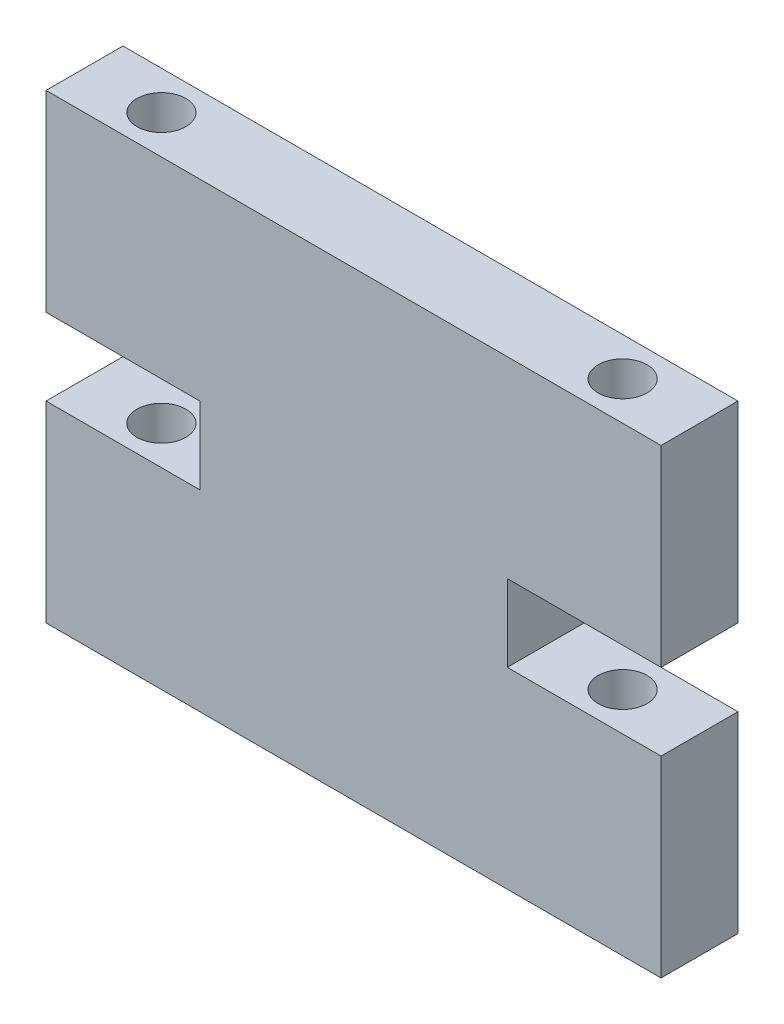
ISO-10303-21;
HEADER;
FILE_DESCRIPTION(('STEP AP214'),'2;1');
FILE_NAME('part.step','',(''),(''),'','','');
FILE_SCHEMA(('AUTOMOTIVE_DESIGN { 1 0 10303 214 1 1 1 1 }'));
ENDSEC;
DATA;
#1=APPLICATION_CONTEXT('core data for automotive mechanical design processes');
#2=APPLICATION_PROTOCOL_DEFINITION('international standard','automotive_design',2000,#1);
#3=PRODUCT_CONTEXT('',#1,'mechanical');
#4=PRODUCT('Part','Part','',(#3));
#5=PRODUCT_RELATED_PRODUCT_CATEGORY('part','',(#4));
#6=PRODUCT_DEFINITION_FORMATION('','',#4);
#7=PRODUCT_DEFINITION_CONTEXT('part definition',#1,'design');
#8=PRODUCT_DEFINITION('design','',#6,#7);
#9=PRODUCT_DEFINITION_SHAPE('','',#8);
#10=(LENGTH_UNIT() NAMED_UNIT(*) SI_UNIT(.MILLI.,.METRE.));
#11=(NAMED_UNIT(*) PLANE_ANGLE_UNIT() SI_UNIT($,.RADIAN.));
#12=(NAMED_UNIT(*) SI_UNIT($,.STERADIAN.) SOLID_ANGLE_UNIT());
#13=UNCERTAINTY_MEASURE_WITH_UNIT(LENGTH_MEASURE(1.E-05),#10,'distance_accuracy_value','');
#14=(GEOMETRIC_REPRESENTATION_CONTEXT(3) GLOBAL_UNCERTAINTY_ASSIGNED_CONTEXT((#13)) GLOBAL_UNIT_ASSIGNED_CONTEXT((#10,
#11,#12)) REPRESENTATION_CONTEXT('',''));
#15=CARTESIAN_POINT('',(0.,0.,0.));
#16=DIRECTION('',(0.,0.,1.));
#17=DIRECTION('',(1.,0.,0.));
#18=AXIS2_PLACEMENT_3D('',#15,#16,#17);
#19=CARTESIAN_POINT('',(20.,-15.,5.));
#20=DIRECTION('',(-1.,0.,0.));
#21=DIRECTION('',(0.,-1.,0.));
#22=AXIS2_PLACEMENT_3D('',#19,#20,#21);
#23=PLANE('',#22);
#24=DIRECTION('',(0.,1.,0.));
#25=VECTOR('',#24,1.);
#26=CARTESIAN_POINT('',(20.,-15.,0.));
#27=LINE('',#26,#25);
#28=CARTESIAN_POINT('',(20.,-15.,0.));
#29=VERTEX_POINT('',#28);
#30=CARTESIAN_POINT('',(20.,-2.5,0.));
#31=VERTEX_POINT('',#30);
#32=EDGE_CURVE('E158',#29,#31,#27,.T.);
#33=ORIENTED_EDGE('',*,*,#32,.T.);
#34=DIRECTION('',(0.,0.,-1.));
#35=VECTOR('',#34,1.);
#36=CARTESIAN_POINT('',(20.,-2.5,5.));
#37=LINE('',#36,#35);
#38=CARTESIAN_POINT('',(20.,-2.5,5.));
#39=VERTEX_POINT('',#38);
#40=EDGE_CURVE('E41',#39,#31,#37,.T.);
#41=ORIENTED_EDGE('',*,*,#40,.F.);
#42=DIRECTION('',(0.,1.,0.));
#43=VECTOR('',#42,1.);
#44=CARTESIAN_POINT('',(20.,-15.,5.));
#45=LINE('',#44,#43);
#46=CARTESIAN_POINT('',(20.,-15.,5.));
#47=VERTEX_POINT('',#46);
#48=EDGE_CURVE('E106',#47,#39,#45,.T.);
#49=ORIENTED_EDGE('',*,*,#48,.F.);
#50=DIRECTION('',(0.,0.,-1.));
#51=VECTOR('',#50,1.);
#52=CARTESIAN_POINT('',(20.,-15.,5.));
#53=LINE('',#52,#51);
#54=EDGE_CURVE('E11',#47,#29,#53,.T.);
#55=ORIENTED_EDGE('',*,*,#54,.T.);
#56=EDGE_LOOP('',(#33,#41,#49,#55));
#57=FACE_BOUND('',#56,.T.);
#58=ADVANCED_FACE('F33',(#57),#23,.F.);
#59=CARTESIAN_POINT('',(10.,-2.5,5.));
#60=DIRECTION('',(0.,-1.,0.));
#61=DIRECTION('',(1.,0.,0.));
#62=AXIS2_PLACEMENT_3D('',#59,#60,#61);
#63=PLANE('',#62);
#64=CARTESIAN_POINT('',(15.,-2.5,2.5));
#65=DIRECTION('',(0.,-1.,0.));
#66=DIRECTION('',(1.,0.,0.));
#67=AXIS2_PLACEMENT_3D('',#64,#65,#66);
#68=CIRCLE('',#67,1.59181252452168);
#69=CARTESIAN_POINT('',(16.5918125245217,-2.5,2.5));
#70=VERTEX_POINT('',#69);
#71=EDGE_CURVE('E305',#70,#70,#68,.F.);
#72=ORIENTED_EDGE('',*,*,#71,.F.);
#73=EDGE_LOOP('',(#72));
#74=FACE_BOUND('',#73,.T.);
#75=DIRECTION('',(-1.,0.,0.));
#76=VECTOR('',#75,1.);
#77=CARTESIAN_POINT('',(10.,-2.5,0.));
#78=LINE('',#77,#76);
#79=CARTESIAN_POINT('',(10.,-2.5,0.));
#80=VERTEX_POINT('',#79);
#81=EDGE_CURVE('E160',#31,#80,#78,.T.);
#82=ORIENTED_EDGE('',*,*,#81,.T.);
#83=DIRECTION('',(0.,0.,-1.));
#84=VECTOR('',#83,1.);
#85=CARTESIAN_POINT('',(10.,-2.5,5.));
#86=LINE('',#85,#84);
#87=CARTESIAN_POINT('',(10.,-2.5,5.));
#88=VERTEX_POINT('',#87);
#89=EDGE_CURVE('E199',#88,#80,#86,.T.);
#90=ORIENTED_EDGE('',*,*,#89,.F.);
#91=DIRECTION('',(-1.,0.,0.));
#92=VECTOR('',#91,1.);
#93=CARTESIAN_POINT('',(10.,-2.5,5.));
#94=LINE('',#93,#92);
#95=EDGE_CURVE('E207',#39,#88,#94,.T.);
#96=ORIENTED_EDGE('',*,*,#95,.F.);
#97=ORIENTED_EDGE('',*,*,#40,.T.);
#98=EDGE_LOOP('',(#82,#90,#96,#97));
#99=FACE_BOUND('',#98,.T.);
#100=ADVANCED_FACE('F205',(#74,#99),#63,.F.);
#101=CARTESIAN_POINT('',(10.,2.5,5.));
#102=DIRECTION('',(-1.,0.,0.));
#103=DIRECTION('',(0.,0.,1.));
#104=AXIS2_PLACEMENT_3D('',#101,#102,#103);
#105=PLANE('',#104);
#106=DIRECTION('',(0.,1.,0.));
#107=VECTOR('',#106,1.);
#108=CARTESIAN_POINT('',(10.,2.5,0.));
#109=LINE('',#108,#107);
#110=CARTESIAN_POINT('',(10.,2.5,0.));
#111=VERTEX_POINT('',#110);
#112=EDGE_CURVE('E163',#80,#111,#109,.T.);
#113=ORIENTED_EDGE('',*,*,#112,.T.);
#114=DIRECTION('',(0.,0.,-1.));
#115=VECTOR('',#114,1.);
#116=CARTESIAN_POINT('',(10.,2.5,5.));
#117=LINE('',#116,#115);
#118=CARTESIAN_POINT('',(10.,2.5,5.));
#119=VERTEX_POINT('',#118);
#120=EDGE_CURVE('E196',#119,#111,#117,.T.);
#121=ORIENTED_EDGE('',*,*,#120,.F.);
#122=DIRECTION('',(0.,1.,0.));
#123=VECTOR('',#122,1.);
#124=CARTESIAN_POINT('',(10.,2.5,5.));
#125=LINE('',#124,#123);
#126=EDGE_CURVE('E223',#88,#119,#125,.T.);
#127=ORIENTED_EDGE('',*,*,#126,.F.);
#128=ORIENTED_EDGE('',*,*,#89,.T.);
#129=EDGE_LOOP('',(#113,#121,#127,#128));
#130=FACE_BOUND('',#129,.T.);
#131=ADVANCED_FACE('F214',(#130),#105,.F.);
#132=CARTESIAN_POINT('',(10.,2.5,5.));
#133=DIRECTION('',(0.,1.,0.));
#134=DIRECTION('',(-1.,0.,0.));
#135=AXIS2_PLACEMENT_3D('',#132,#133,#134);
#136=PLANE('',#135);
#137=CARTESIAN_POINT('',(15.,2.5,2.5));
#138=DIRECTION('',(0.,1.,0.));
#139=DIRECTION('',(-1.,0.,0.));
#140=AXIS2_PLACEMENT_3D('',#137,#138,#139);
#141=CIRCLE('',#140,1.59181252452168);
#142=CARTESIAN_POINT('',(13.4081874754783,2.5,2.5));
#143=VERTEX_POINT('',#142);
#144=EDGE_CURVE('E307',#143,#143,#141,.F.);
#145=ORIENTED_EDGE('',*,*,#144,.F.);
#146=EDGE_LOOP('',(#145));
#147=FACE_BOUND('',#146,.T.);
#148=DIRECTION('',(1.,0.,0.));
#149=VECTOR('',#148,1.);
#150=CARTESIAN_POINT('',(10.,2.5,0.));
#151=LINE('',#150,#149);
#152=CARTESIAN_POINT('',(20.,2.5,0.));
#153=VERTEX_POINT('',#152);
#154=EDGE_CURVE('E165',#111,#153,#151,.T.);
#155=ORIENTED_EDGE('',*,*,#154,.T.);
#156=DIRECTION('',(0.,0.,-1.));
#157=VECTOR('',#156,1.);
#158=CARTESIAN_POINT('',(20.,2.5,5.));
#159=LINE('',#158,#157);
#160=CARTESIAN_POINT('',(20.,2.5,5.));
#161=VERTEX_POINT('',#160);
#162=EDGE_CURVE('E193',#161,#153,#159,.T.);
#163=ORIENTED_EDGE('',*,*,#162,.F.);
#164=DIRECTION('',(1.,0.,0.));
#165=VECTOR('',#164,1.);
#166=CARTESIAN_POINT('',(10.,2.5,5.));
#167=LINE('',#166,#165);
#168=EDGE_CURVE('E220',#119,#161,#167,.T.);
#169=ORIENTED_EDGE('',*,*,#168,.F.);
#170=ORIENTED_EDGE('',*,*,#120,.T.);
#171=EDGE_LOOP('',(#155,#163,#169,#170));
#172=FACE_BOUND('',#171,.T.);
#173=ADVANCED_FACE('F218',(#147,#172),#136,.F.);
#174=CARTESIAN_POINT('',(20.,15.,5.));
#175=DIRECTION('',(-1.,0.,0.));
#176=DIRECTION('',(0.,-1.,0.));
#177=AXIS2_PLACEMENT_3D('',#174,#175,#176);
#178=PLANE('',#177);
#179=DIRECTION('',(0.,1.,0.));
#180=VECTOR('',#179,1.);
#181=CARTESIAN_POINT('',(20.,15.,0.));
#182=LINE('',#181,#180);
#183=CARTESIAN_POINT('',(20.,15.,0.));
#184=VERTEX_POINT('',#183);
#185=EDGE_CURVE('E167',#153,#184,#182,.T.);
#186=ORIENTED_EDGE('',*,*,#185,.T.);
#187=DIRECTION('',(0.,0.,-1.));
#188=VECTOR('',#187,1.);
#189=CARTESIAN_POINT('',(20.,15.,5.));
#190=LINE('',#189,#188);
#191=CARTESIAN_POINT('',(20.,15.,5.));
#192=VERTEX_POINT('',#191);
#193=EDGE_CURVE('E190',#192,#184,#190,.T.);
#194=ORIENTED_EDGE('',*,*,#193,.F.);
#195=DIRECTION('',(0.,1.,0.));
#196=VECTOR('',#195,1.);
#197=CARTESIAN_POINT('',(20.,15.,5.));
#198=LINE('',#197,#196);
#199=EDGE_CURVE('E222',#161,#192,#198,.T.);
#200=ORIENTED_EDGE('',*,*,#199,.F.);
#201=ORIENTED_EDGE('',*,*,#162,.T.);
#202=EDGE_LOOP('',(#186,#194,#200,#201));
#203=FACE_BOUND('',#202,.T.);
#204=ADVANCED_FACE('F259',(#203),#178,.F.);
#205=CARTESIAN_POINT('',(-15.,15.,5.));
#206=DIRECTION('',(0.,-1.,0.));
#207=DIRECTION('',(1.,0.,0.));
#208=AXIS2_PLACEMENT_3D('',#205,#206,#207);
#209=PLANE('',#208);
#210=CARTESIAN_POINT('',(15.,15.,2.5));
#211=DIRECTION('',(0.,-1.,0.));
#212=DIRECTION('',(1.,0.,0.));
#213=AXIS2_PLACEMENT_3D('',#210,#211,#212);
#214=CIRCLE('',#213,1.59181252452168);
#215=CARTESIAN_POINT('',(16.5918125245217,15.,2.5));
#216=VERTEX_POINT('',#215);
#217=EDGE_CURVE('E446',#216,#216,#214,.T.);
#218=ORIENTED_EDGE('',*,*,#217,.T.);
#219=EDGE_LOOP('',(#218));
#220=FACE_BOUND('',#219,.T.);
#221=CARTESIAN_POINT('',(-15.,15.,2.5));
#222=DIRECTION('',(0.,1.,0.));
#223=DIRECTION('',(-1.,0.,0.));
#224=AXIS2_PLACEMENT_3D('',#221,#222,#223);
#225=CIRCLE('',#224,1.59181252452168);
#226=CARTESIAN_POINT('',(-16.5918125245217,15.,2.5));
#227=VERTEX_POINT('',#226);
#228=EDGE_CURVE('E306',#227,#227,#225,.T.);
#229=ORIENTED_EDGE('',*,*,#228,.F.);
#230=EDGE_LOOP('',(#229));
#231=FACE_BOUND('',#230,.T.);
#232=DIRECTION('',(-1.,0.,0.));
#233=VECTOR('',#232,1.);
#234=CARTESIAN_POINT('',(-15.,15.,0.));
#235=LINE('',#234,#233);
#236=CARTESIAN_POINT('',(-20.,15.,0.));
#237=VERTEX_POINT('',#236);
#238=EDGE_CURVE('E170',#184,#237,#235,.T.);
#239=ORIENTED_EDGE('',*,*,#238,.T.);
#240=DIRECTION('',(0.,0.,-1.));
#241=VECTOR('',#240,1.);
#242=CARTESIAN_POINT('',(-20.,15.,5.));
#243=LINE('',#242,#241);
#244=CARTESIAN_POINT('',(-20.,15.,5.));
#245=VERTEX_POINT('',#244);
#246=EDGE_CURVE('E187',#245,#237,#243,.T.);
#247=ORIENTED_EDGE('',*,*,#246,.F.);
#248=DIRECTION('',(-1.,0.,0.));
#249=VECTOR('',#248,1.);
#250=CARTESIAN_POINT('',(15.,15.,5.));
#251=LINE('',#250,#249);
#252=EDGE_CURVE('E225',#192,#245,#251,.T.);
#253=ORIENTED_EDGE('',*,*,#252,.F.);
#254=ORIENTED_EDGE('',*,*,#193,.T.);
#255=EDGE_LOOP('',(#239,#247,#253,#254));
#256=FACE_BOUND('',#255,.T.);
#257=ADVANCED_FACE('F263',(#220,#231,#256),#209,.F.);
#258=CARTESIAN_POINT('',(-20.,15.,5.));
#259=DIRECTION('',(1.,0.,0.));
#260=DIRECTION('',(0.,1.,0.));
#261=AXIS2_PLACEMENT_3D('',#258,#259,#260);
#262=PLANE('',#261);
#263=DIRECTION('',(0.,-1.,0.));
#264=VECTOR('',#263,1.);
#265=CARTESIAN_POINT('',(-20.,15.,0.));
#266=LINE('',#265,#264);
#267=CARTESIAN_POINT('',(-20.,2.5,0.));
#268=VERTEX_POINT('',#267);
#269=EDGE_CURVE('E172',#237,#268,#266,.T.);
#270=ORIENTED_EDGE('',*,*,#269,.T.);
#271=DIRECTION('',(0.,0.,-1.));
#272=VECTOR('',#271,1.);
#273=CARTESIAN_POINT('',(-20.,2.5,5.));
#274=LINE('',#273,#272);
#275=CARTESIAN_POINT('',(-20.,2.5,5.));
#276=VERTEX_POINT('',#275);
#277=EDGE_CURVE('E184',#276,#268,#274,.T.);
#278=ORIENTED_EDGE('',*,*,#277,.F.);
#279=DIRECTION('',(0.,-1.,0.));
#280=VECTOR('',#279,1.);
#281=CARTESIAN_POINT('',(-20.,15.,5.));
#282=LINE('',#281,#280);
#283=EDGE_CURVE('E231',#245,#276,#282,.T.);
#284=ORIENTED_EDGE('',*,*,#283,.F.);
#285=ORIENTED_EDGE('',*,*,#246,.T.);
#286=EDGE_LOOP('',(#270,#278,#284,#285));
#287=FACE_BOUND('',#286,.T.);
#288=ADVANCED_FACE('F237',(#287),#262,.F.);
#289=CARTESIAN_POINT('',(-10.,2.5,5.));
#290=DIRECTION('',(0.,1.,0.));
#291=DIRECTION('',(-1.,0.,0.));
#292=AXIS2_PLACEMENT_3D('',#289,#290,#291);
#293=PLANE('',#292);
#294=CARTESIAN_POINT('',(-15.,2.5,2.5));
#295=DIRECTION('',(0.,1.,0.));
#296=DIRECTION('',(-1.,0.,0.));
#297=AXIS2_PLACEMENT_3D('',#294,#295,#296);
#298=CIRCLE('',#297,1.59181252452168);
#299=CARTESIAN_POINT('',(-16.5918125245217,2.5,2.5));
#300=VERTEX_POINT('',#299);
#301=EDGE_CURVE('E161',#300,#300,#298,.T.);
#302=ORIENTED_EDGE('',*,*,#301,.T.);
#303=EDGE_LOOP('',(#302));
#304=FACE_BOUND('',#303,.T.);
#305=DIRECTION('',(1.,0.,0.));
#306=VECTOR('',#305,1.);
#307=CARTESIAN_POINT('',(-10.,2.5,0.));
#308=LINE('',#307,#306);
#309=CARTESIAN_POINT('',(-10.,2.5,0.));
#310=VERTEX_POINT('',#309);
#311=EDGE_CURVE('E174',#268,#310,#308,.T.);
#312=ORIENTED_EDGE('',*,*,#311,.T.);
#313=DIRECTION('',(0.,0.,-1.));
#314=VECTOR('',#313,1.);
#315=CARTESIAN_POINT('',(-10.,2.5,5.));
#316=LINE('',#315,#314);
#317=CARTESIAN_POINT('',(-10.,2.5,5.));
#318=VERTEX_POINT('',#317);
#319=EDGE_CURVE('E147',#318,#310,#316,.T.);
#320=ORIENTED_EDGE('',*,*,#319,.F.);
#321=DIRECTION('',(1.,0.,0.));
#322=VECTOR('',#321,1.);
#323=CARTESIAN_POINT('',(-10.,2.5,5.));
#324=LINE('',#323,#322);
#325=EDGE_CURVE('E138',#276,#318,#324,.T.);
#326=ORIENTED_EDGE('',*,*,#325,.F.);
#327=ORIENTED_EDGE('',*,*,#277,.T.);
#328=EDGE_LOOP('',(#312,#320,#326,#327));
#329=FACE_BOUND('',#328,.T.);
#330=ADVANCED_FACE('F241',(#304,#329),#293,.F.);
#331=CARTESIAN_POINT('',(-10.,2.5,5.));
#332=DIRECTION('',(1.,0.,0.));
#333=DIRECTION('',(0.,0.,-1.));
#334=AXIS2_PLACEMENT_3D('',#331,#332,#333);
#335=PLANE('',#334);
#336=DIRECTION('',(0.,-1.,0.));
#337=VECTOR('',#336,1.);
#338=CARTESIAN_POINT('',(-10.,2.5,0.));
#339=LINE('',#338,#337);
#340=CARTESIAN_POINT('',(-10.,-2.5,0.));
#341=VERTEX_POINT('',#340);
#342=EDGE_CURVE('E146',#310,#341,#339,.T.);
#343=ORIENTED_EDGE('',*,*,#342,.T.);
#344=DIRECTION('',(0.,0.,-1.));
#345=VECTOR('',#344,1.);
#346=CARTESIAN_POINT('',(-10.,-2.5,5.));
#347=LINE('',#346,#345);
#348=CARTESIAN_POINT('',(-10.,-2.5,5.));
#349=VERTEX_POINT('',#348);
#350=EDGE_CURVE('E143',#349,#341,#347,.T.);
#351=ORIENTED_EDGE('',*,*,#350,.F.);
#352=DIRECTION('',(0.,-1.,0.));
#353=VECTOR('',#352,1.);
#354=CARTESIAN_POINT('',(-10.,2.5,5.));
#355=LINE('',#354,#353);
#356=EDGE_CURVE('E132',#318,#349,#355,.T.);
#357=ORIENTED_EDGE('',*,*,#356,.F.);
#358=ORIENTED_EDGE('',*,*,#319,.T.);
#359=EDGE_LOOP('',(#343,#351,#357,#358));
#360=FACE_BOUND('',#359,.T.);
#361=ADVANCED_FACE('F144',(#360),#335,.F.);
#362=CARTESIAN_POINT('',(-10.,-2.5,5.));
#363=DIRECTION('',(0.,-1.,0.));
#364=DIRECTION('',(1.,0.,0.));
#365=AXIS2_PLACEMENT_3D('',#362,#363,#364);
#366=PLANE('',#365);
#367=CARTESIAN_POINT('',(-15.,-2.5,2.5));
#368=DIRECTION('',(0.,-1.,0.));
#369=DIRECTION('',(1.,0.,0.));
#370=AXIS2_PLACEMENT_3D('',#367,#368,#369);
#371=CIRCLE('',#370,1.59181252452168);
#372=CARTESIAN_POINT('',(-13.4081874754783,-2.5,2.5));
#373=VERTEX_POINT('',#372);
#374=EDGE_CURVE('E317',#373,#373,#371,.T.);
#375=ORIENTED_EDGE('',*,*,#374,.T.);
#376=EDGE_LOOP('',(#375));
#377=FACE_BOUND('',#376,.T.);
#378=DIRECTION('',(-1.,0.,0.));
#379=VECTOR('',#378,1.);
#380=CARTESIAN_POINT('',(-10.,-2.5,0.));
#381=LINE('',#380,#379);
#382=CARTESIAN_POINT('',(-20.,-2.5,0.));
#383=VERTEX_POINT('',#382);
#384=EDGE_CURVE('E91',#341,#383,#381,.T.);
#385=ORIENTED_EDGE('',*,*,#384,.T.);
#386=DIRECTION('',(0.,0.,-1.));
#387=VECTOR('',#386,1.);
#388=CARTESIAN_POINT('',(-20.,-2.5,5.));
#389=LINE('',#388,#387);
#390=CARTESIAN_POINT('',(-20.,-2.5,5.));
#391=VERTEX_POINT('',#390);
#392=EDGE_CURVE('E148',#391,#383,#389,.T.);
#393=ORIENTED_EDGE('',*,*,#392,.F.);
#394=DIRECTION('',(-1.,0.,0.));
#395=VECTOR('',#394,1.);
#396=CARTESIAN_POINT('',(-10.,-2.5,5.));
#397=LINE('',#396,#395);
#398=EDGE_CURVE('E136',#349,#391,#397,.T.);
#399=ORIENTED_EDGE('',*,*,#398,.F.);
#400=ORIENTED_EDGE('',*,*,#350,.T.);
#401=EDGE_LOOP('',(#385,#393,#399,#400));
#402=FACE_BOUND('',#401,.T.);
#403=ADVANCED_FACE('F150',(#377,#402),#366,.F.);
#404=CARTESIAN_POINT('',(-20.,-15.,5.));
#405=DIRECTION('',(1.,0.,0.));
#406=DIRECTION('',(0.,1.,0.));
#407=AXIS2_PLACEMENT_3D('',#404,#405,#406);
#408=PLANE('',#407);
#409=DIRECTION('',(0.,-1.,0.));
#410=VECTOR('',#409,1.);
#411=CARTESIAN_POINT('',(-20.,-15.,0.));
#412=LINE('',#411,#410);
#413=CARTESIAN_POINT('',(-20.,-15.,0.));
#414=VERTEX_POINT('',#413);
#415=EDGE_CURVE('E178',#383,#414,#412,.T.);
#416=ORIENTED_EDGE('',*,*,#415,.T.);
#417=DIRECTION('',(0.,0.,-1.));
#418=VECTOR('',#417,1.);
#419=CARTESIAN_POINT('',(-20.,-15.,5.));
#420=LINE('',#419,#418);
#421=CARTESIAN_POINT('',(-20.,-15.,5.));
#422=VERTEX_POINT('',#421);
#423=EDGE_CURVE('E154',#422,#414,#420,.T.);
#424=ORIENTED_EDGE('',*,*,#423,.F.);
#425=DIRECTION('',(0.,-1.,0.));
#426=VECTOR('',#425,1.);
#427=CARTESIAN_POINT('',(-20.,-15.,5.));
#428=LINE('',#427,#426);
#429=EDGE_CURVE('E152',#391,#422,#428,.T.);
#430=ORIENTED_EDGE('',*,*,#429,.F.);
#431=ORIENTED_EDGE('',*,*,#392,.T.);
#432=EDGE_LOOP('',(#416,#424,#430,#431));
#433=FACE_BOUND('',#432,.T.);
#434=ADVANCED_FACE('F244',(#433),#408,.F.);
#435=CARTESIAN_POINT('',(-15.,-15.,5.));
#436=DIRECTION('',(0.,1.,0.));
#437=DIRECTION('',(0.,0.,1.));
#438=AXIS2_PLACEMENT_3D('',#435,#436,#437);
#439=PLANE('',#438);
#440=CARTESIAN_POINT('',(15.,-15.,2.5));
#441=DIRECTION('',(0.,-1.,0.));
#442=DIRECTION('',(1.,0.,0.));
#443=AXIS2_PLACEMENT_3D('',#440,#441,#442);
#444=CIRCLE('',#443,1.59181252452168);
#445=CARTESIAN_POINT('',(16.5918125245217,-15.,2.5));
#446=VERTEX_POINT('',#445);
#447=EDGE_CURVE('E303',#446,#446,#444,.T.);
#448=ORIENTED_EDGE('',*,*,#447,.F.);
#449=EDGE_LOOP('',(#448));
#450=FACE_BOUND('',#449,.T.);
#451=CARTESIAN_POINT('',(-15.,-15.,2.5));
#452=DIRECTION('',(0.,1.,0.));
#453=DIRECTION('',(-1.,0.,0.));
#454=AXIS2_PLACEMENT_3D('',#451,#452,#453);
#455=CIRCLE('',#454,1.59181252452168);
#456=CARTESIAN_POINT('',(-16.5918125245217,-15.,2.5));
#457=VERTEX_POINT('',#456);
#458=EDGE_CURVE('E310',#457,#457,#455,.T.);
#459=ORIENTED_EDGE('',*,*,#458,.T.);
#460=EDGE_LOOP('',(#459));
#461=FACE_BOUND('',#460,.T.);
#462=DIRECTION('',(1.,0.,0.));
#463=VECTOR('',#462,1.);
#464=CARTESIAN_POINT('',(-15.,-15.,0.));
#465=LINE('',#464,#463);
#466=EDGE_CURVE('E98',#414,#29,#465,.T.);
#467=ORIENTED_EDGE('',*,*,#466,.T.);
#468=ORIENTED_EDGE('',*,*,#54,.F.);
#469=DIRECTION('',(1.,0.,0.));
#470=VECTOR('',#469,1.);
#471=CARTESIAN_POINT('',(15.,-15.,5.));
#472=LINE('',#471,#470);
#473=EDGE_CURVE('E49',#422,#47,#472,.T.);
#474=ORIENTED_EDGE('',*,*,#473,.F.);
#475=ORIENTED_EDGE('',*,*,#423,.T.);
#476=EDGE_LOOP('',(#467,#468,#474,#475));
#477=FACE_BOUND('',#476,.T.);
#478=ADVANCED_FACE('F245',(#450,#461,#477),#439,.F.);
#479=CARTESIAN_POINT('',(0.,0.,5.));
#480=DIRECTION('',(0.,0.,1.));
#481=DIRECTION('',(1.,0.,0.));
#482=AXIS2_PLACEMENT_3D('',#479,#480,#481);
#483=PLANE('',#482);
#484=ORIENTED_EDGE('',*,*,#473,.T.);
#485=ORIENTED_EDGE('',*,*,#48,.T.);
#486=ORIENTED_EDGE('',*,*,#95,.T.);
#487=ORIENTED_EDGE('',*,*,#126,.T.);
#488=ORIENTED_EDGE('',*,*,#168,.T.);
#489=ORIENTED_EDGE('',*,*,#199,.T.);
#490=ORIENTED_EDGE('',*,*,#252,.T.);
#491=ORIENTED_EDGE('',*,*,#283,.T.);
#492=ORIENTED_EDGE('',*,*,#325,.T.);
#493=ORIENTED_EDGE('',*,*,#356,.T.);
#494=ORIENTED_EDGE('',*,*,#398,.T.);
#495=ORIENTED_EDGE('',*,*,#429,.T.);
#496=EDGE_LOOP('',(#484,#485,#486,#487,#488,#489,#490,#491,#492,#493,#494,#495));
#497=FACE_BOUND('',#496,.T.);
#498=ADVANCED_FACE('F134',(#497),#483,.T.);
#499=CARTESIAN_POINT('',(0.,0.,0.));
#500=DIRECTION('',(0.,0.,1.));
#501=DIRECTION('',(1.,0.,0.));
#502=AXIS2_PLACEMENT_3D('',#499,#500,#501);
#503=PLANE('',#502);
#504=ORIENTED_EDGE('',*,*,#32,.F.);
#505=ORIENTED_EDGE('',*,*,#466,.F.);
#506=ORIENTED_EDGE('',*,*,#415,.F.);
#507=ORIENTED_EDGE('',*,*,#384,.F.);
#508=ORIENTED_EDGE('',*,*,#342,.F.);
#509=ORIENTED_EDGE('',*,*,#311,.F.);
#510=ORIENTED_EDGE('',*,*,#269,.F.);
#511=ORIENTED_EDGE('',*,*,#238,.F.);
#512=ORIENTED_EDGE('',*,*,#185,.F.);
#513=ORIENTED_EDGE('',*,*,#154,.F.);
#514=ORIENTED_EDGE('',*,*,#112,.F.);
#515=ORIENTED_EDGE('',*,*,#81,.F.);
#516=EDGE_LOOP('',(#504,#505,#506,#507,#508,#509,#510,#511,#512,#513,#514,#515));
#517=FACE_BOUND('',#516,.T.);
#518=ADVANCED_FACE('F209',(#517),#503,.F.);
#519=CARTESIAN_POINT('',(-15.,-15.,2.5));
#520=DIRECTION('',(0.,1.,0.));
#521=DIRECTION('',(-1.,0.,0.));
#522=AXIS2_PLACEMENT_3D('',#519,#520,#521);
#523=CYLINDRICAL_SURFACE('',#522,1.59181252452168);
#524=ORIENTED_EDGE('',*,*,#458,.F.);
#525=EDGE_LOOP('',(#524));
#526=FACE_BOUND('',#525,.T.);
#527=ORIENTED_EDGE('',*,*,#374,.F.);
#528=EDGE_LOOP('',(#527));
#529=FACE_BOUND('',#528,.T.);
#530=ADVANCED_FACE('F285',(#526,#529),#523,.F.);
#531=ORIENTED_EDGE('',*,*,#228,.T.);
#532=EDGE_LOOP('',(#531));
#533=FACE_BOUND('',#532,.T.);
#534=ORIENTED_EDGE('',*,*,#301,.F.);
#535=EDGE_LOOP('',(#534));
#536=FACE_BOUND('',#535,.T.);
#537=ADVANCED_FACE('F288',(#533,#536),#523,.F.);
#538=CARTESIAN_POINT('',(15.,-15.,2.5));
#539=DIRECTION('',(0.,1.,0.));
#540=DIRECTION('',(-1.,0.,0.));
#541=AXIS2_PLACEMENT_3D('',#538,#539,#540);
#542=CYLINDRICAL_SURFACE('',#541,1.59181252452168);
#543=ORIENTED_EDGE('',*,*,#447,.T.);
#544=EDGE_LOOP('',(#543));
#545=FACE_BOUND('',#544,.T.);
#546=ORIENTED_EDGE('',*,*,#71,.T.);
#547=EDGE_LOOP('',(#546));
#548=FACE_BOUND('',#547,.T.);
#549=ADVANCED_FACE('F291',(#545,#548),#542,.F.);
#550=ORIENTED_EDGE('',*,*,#217,.F.);
#551=EDGE_LOOP('',(#550));
#552=FACE_BOUND('',#551,.T.);
#553=ORIENTED_EDGE('',*,*,#144,.T.);
#554=EDGE_LOOP('',(#553));
#555=FACE_BOUND('',#554,.T.);
#556=ADVANCED_FACE('F294',(#552,#555),#542,.F.);
#557=CLOSED_SHELL('',(#58,#100,#131,#173,#204,#257,#288,#330,#361,#403,#434,#478,#498,#518,#530,
#537,#549,#556));
#558=MANIFOLD_SOLID_BREP('B2',#557);
#559=ADVANCED_BREP_SHAPE_REPRESENTATION('',(#18,#558),#14);
#560=SHAPE_DEFINITION_REPRESENTATION(#9,#559);
ENDSEC;
END-ISO-10303-21;
